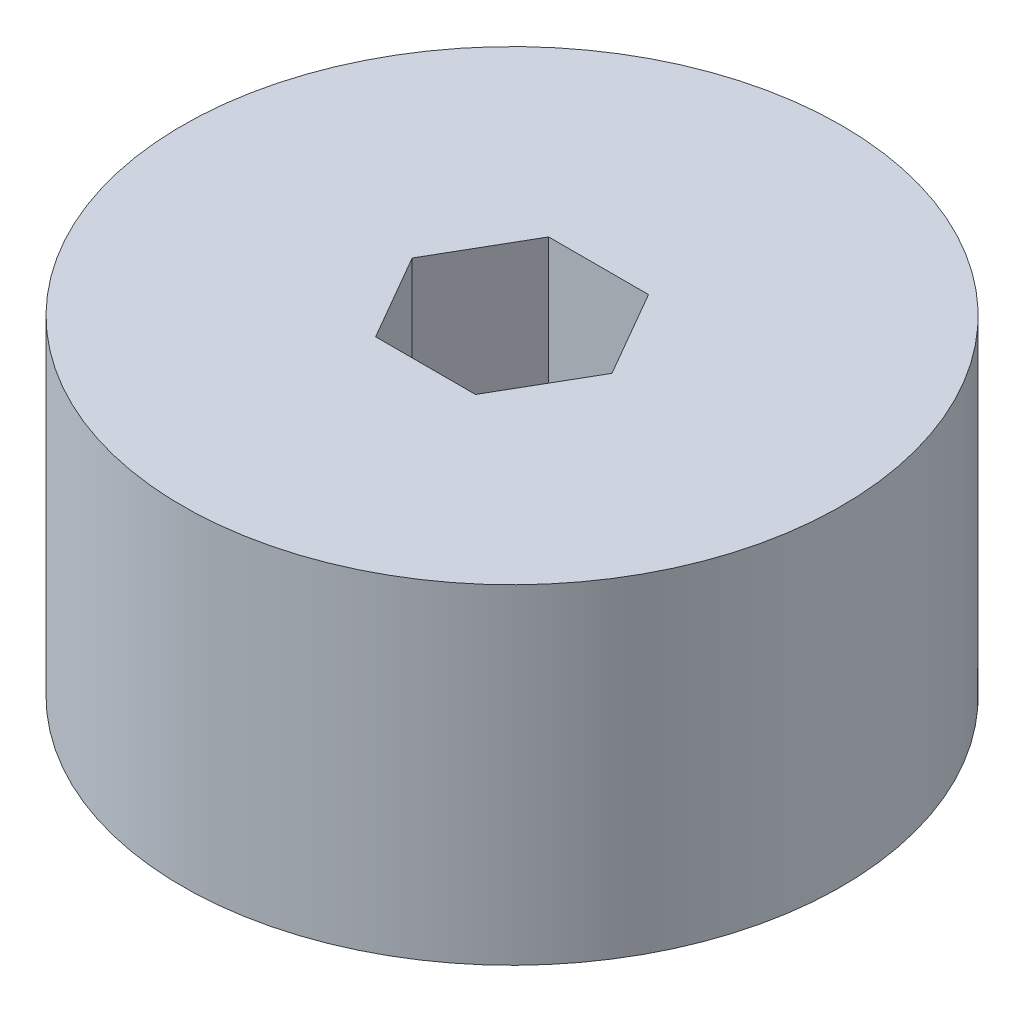
ISO-10303-21;
HEADER;
FILE_DESCRIPTION(('STEP AP214'),'2;1');
FILE_NAME('part.step','',(''),(''),'','','');
FILE_SCHEMA(('AUTOMOTIVE_DESIGN { 1 0 10303 214 1 1 1 1 }'));
ENDSEC;
DATA;
#1=APPLICATION_CONTEXT('core data for automotive mechanical design processes');
#2=APPLICATION_PROTOCOL_DEFINITION('international standard','automotive_design',2000,#1);
#3=PRODUCT_CONTEXT('',#1,'mechanical');
#4=PRODUCT('Part','Part','',(#3));
#5=PRODUCT_RELATED_PRODUCT_CATEGORY('part','',(#4));
#6=PRODUCT_DEFINITION_FORMATION('','',#4);
#7=PRODUCT_DEFINITION_CONTEXT('part definition',#1,'design');
#8=PRODUCT_DEFINITION('design','',#6,#7);
#9=PRODUCT_DEFINITION_SHAPE('','',#8);
#10=(LENGTH_UNIT() NAMED_UNIT(*) SI_UNIT(.MILLI.,.METRE.));
#11=(NAMED_UNIT(*) PLANE_ANGLE_UNIT() SI_UNIT($,.RADIAN.));
#12=(NAMED_UNIT(*) SI_UNIT($,.STERADIAN.) SOLID_ANGLE_UNIT());
#13=UNCERTAINTY_MEASURE_WITH_UNIT(LENGTH_MEASURE(1.E-05),#10,'distance_accuracy_value','');
#14=(GEOMETRIC_REPRESENTATION_CONTEXT(3) GLOBAL_UNCERTAINTY_ASSIGNED_CONTEXT((#13)) GLOBAL_UNIT_ASSIGNED_CONTEXT((#10,
#11,#12)) REPRESENTATION_CONTEXT('',''));
#15=CARTESIAN_POINT('',(0.,0.,0.));
#16=DIRECTION('',(0.,0.,1.));
#17=DIRECTION('',(1.,0.,0.));
#18=AXIS2_PLACEMENT_3D('',#15,#16,#17);
#19=CARTESIAN_POINT('',(0.,4.7625,0.));
#20=DIRECTION('',(0.,-1.,0.));
#21=DIRECTION('',(0.,0.,-1.));
#22=AXIS2_PLACEMENT_3D('',#19,#20,#21);
#23=CYLINDRICAL_SURFACE('',#22,4.7625);
#24=CARTESIAN_POINT('',(0.,4.7625,0.));
#25=DIRECTION('',(0.,1.,0.));
#26=DIRECTION('',(0.,0.,1.));
#27=AXIS2_PLACEMENT_3D('',#24,#25,#26);
#28=CIRCLE('',#27,4.7625);
#29=CARTESIAN_POINT('',(0.,4.7625,-4.7625));
#30=VERTEX_POINT('',#29);
#31=EDGE_CURVE('E11',#30,#30,#28,.T.);
#32=CARTESIAN_POINT('',(0.,0.,0.));
#33=DIRECTION('',(0.,1.,0.));
#34=DIRECTION('',(0.,0.,1.));
#35=AXIS2_PLACEMENT_3D('',#32,#33,#34);
#36=CIRCLE('',#35,4.7625);
#37=CARTESIAN_POINT('',(0.,0.,-4.7625));
#38=VERTEX_POINT('',#37);
#39=EDGE_CURVE('E38',#38,#38,#36,.T.);
#40=CARTESIAN_POINT('',(0.,4.7625,-4.7625));
#41=CARTESIAN_POINT('',(0.,4.712890625,-4.7625));
#42=CARTESIAN_POINT('',(0.,4.66328125,-4.7625));
#43=CARTESIAN_POINT('',(0.,4.5640625,-4.7625));
#44=CARTESIAN_POINT('',(0.,4.514453125,-4.7625));
#45=CARTESIAN_POINT('',(0.,4.415234375,-4.7625));
#46=CARTESIAN_POINT('',(0.,4.365625,-4.7625));
#47=CARTESIAN_POINT('',(0.,4.26640625,-4.7625));
#48=CARTESIAN_POINT('',(0.,4.216796875,-4.7625));
#49=CARTESIAN_POINT('',(0.,4.117578125,-4.7625));
#50=CARTESIAN_POINT('',(0.,4.06796875,-4.7625));
#51=CARTESIAN_POINT('',(0.,3.96875,-4.7625));
#52=CARTESIAN_POINT('',(0.,3.919140625,-4.7625));
#53=CARTESIAN_POINT('',(0.,3.819921875,-4.7625));
#54=CARTESIAN_POINT('',(0.,3.7703125,-4.7625));
#55=CARTESIAN_POINT('',(0.,3.67109375,-4.7625));
#56=CARTESIAN_POINT('',(0.,3.621484375,-4.7625));
#57=CARTESIAN_POINT('',(0.,3.522265625,-4.7625));
#58=CARTESIAN_POINT('',(0.,3.47265625,-4.7625));
#59=CARTESIAN_POINT('',(0.,3.3734375,-4.7625));
#60=CARTESIAN_POINT('',(0.,3.323828125,-4.7625));
#61=CARTESIAN_POINT('',(0.,3.224609375,-4.7625));
#62=CARTESIAN_POINT('',(0.,3.175,-4.7625));
#63=CARTESIAN_POINT('',(0.,3.07578125,-4.7625));
#64=CARTESIAN_POINT('',(0.,3.026171875,-4.7625));
#65=CARTESIAN_POINT('',(0.,2.926953125,-4.7625));
#66=CARTESIAN_POINT('',(0.,2.87734375,-4.7625));
#67=CARTESIAN_POINT('',(0.,2.778125,-4.7625));
#68=CARTESIAN_POINT('',(0.,2.728515625,-4.7625));
#69=CARTESIAN_POINT('',(0.,2.629296875,-4.7625));
#70=CARTESIAN_POINT('',(0.,2.5796875,-4.7625));
#71=CARTESIAN_POINT('',(0.,2.48046875,-4.7625));
#72=CARTESIAN_POINT('',(0.,2.430859375,-4.7625));
#73=CARTESIAN_POINT('',(0.,2.331640625,-4.7625));
#74=CARTESIAN_POINT('',(0.,2.28203125,-4.7625));
#75=CARTESIAN_POINT('',(0.,2.1828125,-4.7625));
#76=CARTESIAN_POINT('',(0.,2.133203125,-4.7625));
#77=CARTESIAN_POINT('',(0.,2.033984375,-4.7625));
#78=CARTESIAN_POINT('',(0.,1.984375,-4.7625));
#79=CARTESIAN_POINT('',(0.,1.88515625,-4.7625));
#80=CARTESIAN_POINT('',(0.,1.835546875,-4.7625));
#81=CARTESIAN_POINT('',(0.,1.736328125,-4.7625));
#82=CARTESIAN_POINT('',(0.,1.68671875,-4.7625));
#83=CARTESIAN_POINT('',(0.,1.5875,-4.7625));
#84=CARTESIAN_POINT('',(0.,1.537890625,-4.7625));
#85=CARTESIAN_POINT('',(0.,1.438671875,-4.7625));
#86=CARTESIAN_POINT('',(0.,1.3890625,-4.7625));
#87=CARTESIAN_POINT('',(0.,1.28984375,-4.7625));
#88=CARTESIAN_POINT('',(0.,1.240234375,-4.7625));
#89=CARTESIAN_POINT('',(0.,1.141015625,-4.7625));
#90=CARTESIAN_POINT('',(0.,1.09140625,-4.7625));
#91=CARTESIAN_POINT('',(0.,0.992187499999999,-4.7625));
#92=CARTESIAN_POINT('',(0.,0.942578124999999,-4.7625));
#93=CARTESIAN_POINT('',(0.,0.843359375,-4.7625));
#94=CARTESIAN_POINT('',(0.,0.79375,-4.7625));
#95=CARTESIAN_POINT('',(0.,0.69453125,-4.7625));
#96=CARTESIAN_POINT('',(0.,0.644921875,-4.7625));
#97=CARTESIAN_POINT('',(0.,0.545703125,-4.7625));
#98=CARTESIAN_POINT('',(0.,0.49609375,-4.7625));
#99=CARTESIAN_POINT('',(0.,0.396875,-4.7625));
#100=CARTESIAN_POINT('',(0.,0.347265625,-4.7625));
#101=CARTESIAN_POINT('',(0.,0.248046875,-4.7625));
#102=CARTESIAN_POINT('',(0.,0.1984375,-4.7625));
#103=CARTESIAN_POINT('',(0.,0.09921875,-4.7625));
#104=CARTESIAN_POINT('',(0.,0.049609375,-4.7625));
#105=CARTESIAN_POINT('',(0.,0.,-4.7625));
#106=B_SPLINE_CURVE_WITH_KNOTS('',3,(#40,#41,#42,#43,#44,#45,#46,#47,#48,#49,#50,#51,#52,#53,
#54,#55,#56,#57,#58,#59,#60,#61,#62,#63,#64,#65,#66,#67,#68,#69,#70,#71,#72,#73,#74,#75,#76,#77,
#78,#79,#80,#81,#82,#83,#84,#85,#86,#87,#88,#89,#90,#91,#92,#93,#94,#95,#96,#97,#98,#99,#100,
#101,#102,#103,#104,#105),.UNSPECIFIED.,.F.,.F.,(4,2,2,2,2,2,2,2,2,2,2,2,2,2,2,2,2,2,2,2,2,2,2,
2,2,2,2,2,2,2,2,2,4),(0.,0.148828125,0.29765625,0.446484375,0.5953125,0.744140625,
0.892968750000001,1.041796875,1.190625,1.339453125,1.48828125,1.637109375,1.7859375,1.934765625,
2.08359375,2.232421875,2.38125,2.530078125,2.67890625,2.827734375,2.9765625,3.125390625,
3.27421875,3.423046875,3.571875,3.720703125,3.86953125,4.018359375,4.1671875,4.316015625,
4.46484375,4.613671875,4.7625),.UNSPECIFIED.);
#107=EDGE_CURVE('BSEAM35',#30,#38,#106,.T.);
#108=ORIENTED_EDGE('',*,*,#31,.F.);
#109=ORIENTED_EDGE('',*,*,#39,.T.);
#110=ORIENTED_EDGE('',*,*,#107,.T.);
#111=ORIENTED_EDGE('',*,*,#107,.F.);
#112=EDGE_LOOP('',(#108,#110,#109,#111));
#113=FACE_BOUND('',#112,.T.);
#114=ADVANCED_FACE('F35',(#113),#23,.T.);
#115=CARTESIAN_POINT('',(0.,4.7625,0.));
#116=DIRECTION('',(0.,1.,0.));
#117=DIRECTION('',(0.,0.,1.));
#118=AXIS2_PLACEMENT_3D('',#115,#116,#117);
#119=PLANE('',#118);
#120=DIRECTION('',(-0.5,0.,0.866025403784438));
#121=VECTOR('',#120,1.);
#122=CARTESIAN_POINT('',(1.44337567297406,4.7625,0.));
#123=LINE('',#122,#121);
#124=CARTESIAN_POINT('',(1.44337567297406,4.7625,0.));
#125=VERTEX_POINT('',#124);
#126=CARTESIAN_POINT('',(0.721687836487032,4.7625,1.25));
#127=VERTEX_POINT('',#126);
#128=EDGE_CURVE('E89',#125,#127,#123,.T.);
#129=ORIENTED_EDGE('',*,*,#128,.T.);
#130=DIRECTION('',(-1.,0.,0.));
#131=VECTOR('',#130,1.);
#132=CARTESIAN_POINT('',(0.721687836487032,4.7625,1.25));
#133=LINE('',#132,#131);
#134=CARTESIAN_POINT('',(-0.721687836487032,4.7625,1.25));
#135=VERTEX_POINT('',#134);
#136=EDGE_CURVE('E98',#127,#135,#133,.T.);
#137=ORIENTED_EDGE('',*,*,#136,.T.);
#138=DIRECTION('',(-0.5,0.,-0.866025403784439));
#139=VECTOR('',#138,1.);
#140=CARTESIAN_POINT('',(-0.721687836487032,4.7625,1.25));
#141=LINE('',#140,#139);
#142=CARTESIAN_POINT('',(-1.44337567297406,4.7625,0.));
#143=VERTEX_POINT('',#142);
#144=EDGE_CURVE('E49',#135,#143,#141,.T.);
#145=ORIENTED_EDGE('',*,*,#144,.T.);
#146=DIRECTION('',(0.5,0.,-0.866025403784439));
#147=VECTOR('',#146,1.);
#148=CARTESIAN_POINT('',(-1.44337567297406,4.7625,0.));
#149=LINE('',#148,#147);
#150=CARTESIAN_POINT('',(-0.721687836487032,4.7625,-1.25));
#151=VERTEX_POINT('',#150);
#152=EDGE_CURVE('E113',#143,#151,#149,.T.);
#153=ORIENTED_EDGE('',*,*,#152,.T.);
#154=DIRECTION('',(1.,0.,0.));
#155=VECTOR('',#154,1.);
#156=CARTESIAN_POINT('',(-0.721687836487032,4.7625,-1.25));
#157=LINE('',#156,#155);
#158=CARTESIAN_POINT('',(0.721687836487032,4.7625,-1.25));
#159=VERTEX_POINT('',#158);
#160=EDGE_CURVE('E116',#151,#159,#157,.T.);
#161=ORIENTED_EDGE('',*,*,#160,.T.);
#162=DIRECTION('',(0.5,0.,0.866025403784438));
#163=VECTOR('',#162,1.);
#164=CARTESIAN_POINT('',(0.721687836487032,4.7625,-1.25));
#165=LINE('',#164,#163);
#166=EDGE_CURVE('E95',#159,#125,#165,.T.);
#167=ORIENTED_EDGE('',*,*,#166,.T.);
#168=EDGE_LOOP('',(#129,#137,#145,#153,#161,#167));
#169=FACE_BOUND('',#168,.T.);
#170=ORIENTED_EDGE('',*,*,#31,.T.);
#171=EDGE_LOOP('',(#170));
#172=FACE_BOUND('',#171,.T.);
#173=ADVANCED_FACE('F102',(#169,#172),#119,.T.);
#174=CARTESIAN_POINT('',(0.,0.,0.));
#175=DIRECTION('',(0.,1.,0.));
#176=DIRECTION('',(0.,0.,1.));
#177=AXIS2_PLACEMENT_3D('',#174,#175,#176);
#178=PLANE('',#177);
#179=DIRECTION('',(-1.,0.,0.));
#180=VECTOR('',#179,1.);
#181=CARTESIAN_POINT('',(0.721687836487032,0.,1.25));
#182=LINE('',#181,#180);
#183=CARTESIAN_POINT('',(0.721687836487032,0.,1.25));
#184=VERTEX_POINT('',#183);
#185=CARTESIAN_POINT('',(-0.721687836487032,0.,1.25));
#186=VERTEX_POINT('',#185);
#187=EDGE_CURVE('E120',#184,#186,#182,.T.);
#188=ORIENTED_EDGE('',*,*,#187,.F.);
#189=DIRECTION('',(-0.5,0.,0.866025403784438));
#190=VECTOR('',#189,1.);
#191=CARTESIAN_POINT('',(1.44337567297406,0.,0.));
#192=LINE('',#191,#190);
#193=CARTESIAN_POINT('',(1.44337567297406,0.,0.));
#194=VERTEX_POINT('',#193);
#195=EDGE_CURVE('E57',#194,#184,#192,.T.);
#196=ORIENTED_EDGE('',*,*,#195,.F.);
#197=DIRECTION('',(0.5,0.,0.866025403784438));
#198=VECTOR('',#197,1.);
#199=CARTESIAN_POINT('',(0.721687836487032,0.,-1.25));
#200=LINE('',#199,#198);
#201=CARTESIAN_POINT('',(0.721687836487032,0.,-1.25));
#202=VERTEX_POINT('',#201);
#203=EDGE_CURVE('E106',#202,#194,#200,.T.);
#204=ORIENTED_EDGE('',*,*,#203,.F.);
#205=DIRECTION('',(1.,0.,0.));
#206=VECTOR('',#205,1.);
#207=CARTESIAN_POINT('',(-0.721687836487032,0.,-1.25));
#208=LINE('',#207,#206);
#209=CARTESIAN_POINT('',(-0.721687836487032,0.,-1.25));
#210=VERTEX_POINT('',#209);
#211=EDGE_CURVE('E109',#210,#202,#208,.T.);
#212=ORIENTED_EDGE('',*,*,#211,.F.);
#213=DIRECTION('',(0.5,0.,-0.866025403784439));
#214=VECTOR('',#213,1.);
#215=CARTESIAN_POINT('',(-1.44337567297406,0.,0.));
#216=LINE('',#215,#214);
#217=CARTESIAN_POINT('',(-1.44337567297406,0.,0.));
#218=VERTEX_POINT('',#217);
#219=EDGE_CURVE('E125',#218,#210,#216,.T.);
#220=ORIENTED_EDGE('',*,*,#219,.F.);
#221=DIRECTION('',(-0.5,0.,-0.866025403784439));
#222=VECTOR('',#221,1.);
#223=CARTESIAN_POINT('',(-0.721687836487032,0.,1.25));
#224=LINE('',#223,#222);
#225=EDGE_CURVE('E122',#186,#218,#224,.T.);
#226=ORIENTED_EDGE('',*,*,#225,.F.);
#227=EDGE_LOOP('',(#188,#196,#204,#212,#220,#226));
#228=FACE_BOUND('',#227,.T.);
#229=ORIENTED_EDGE('',*,*,#39,.F.);
#230=EDGE_LOOP('',(#229));
#231=FACE_BOUND('',#230,.T.);
#232=ADVANCED_FACE('F142',(#228,#231),#178,.F.);
#233=CARTESIAN_POINT('',(1.44337567297406,4.7625,0.));
#234=DIRECTION('',(0.866025403784438,0.,0.5));
#235=DIRECTION('',(0.5,0.,-0.866025403784438));
#236=AXIS2_PLACEMENT_3D('',#233,#234,#235);
#237=PLANE('',#236);
#238=ORIENTED_EDGE('',*,*,#195,.T.);
#239=DIRECTION('',(0.,-1.,0.));
#240=VECTOR('',#239,1.);
#241=CARTESIAN_POINT('',(0.721687836487032,4.7625,1.25));
#242=LINE('',#241,#240);
#243=EDGE_CURVE('E85',#127,#184,#242,.T.);
#244=ORIENTED_EDGE('',*,*,#243,.F.);
#245=ORIENTED_EDGE('',*,*,#128,.F.);
#246=DIRECTION('',(0.,-1.,0.));
#247=VECTOR('',#246,1.);
#248=CARTESIAN_POINT('',(1.44337567297406,4.7625,0.));
#249=LINE('',#248,#247);
#250=EDGE_CURVE('E130',#125,#194,#249,.T.);
#251=ORIENTED_EDGE('',*,*,#250,.T.);
#252=EDGE_LOOP('',(#238,#244,#245,#251));
#253=FACE_BOUND('',#252,.T.);
#254=ADVANCED_FACE('F87',(#253),#237,.F.);
#255=CARTESIAN_POINT('',(0.721687836487032,4.7625,-1.25));
#256=DIRECTION('',(0.866025403784438,0.,-0.5));
#257=DIRECTION('',(-0.5,0.,-0.866025403784438));
#258=AXIS2_PLACEMENT_3D('',#255,#256,#257);
#259=PLANE('',#258);
#260=ORIENTED_EDGE('',*,*,#203,.T.);
#261=ORIENTED_EDGE('',*,*,#250,.F.);
#262=ORIENTED_EDGE('',*,*,#166,.F.);
#263=DIRECTION('',(0.,-1.,0.));
#264=VECTOR('',#263,1.);
#265=CARTESIAN_POINT('',(0.721687836487032,4.7625,-1.25));
#266=LINE('',#265,#264);
#267=EDGE_CURVE('E132',#159,#202,#266,.T.);
#268=ORIENTED_EDGE('',*,*,#267,.T.);
#269=EDGE_LOOP('',(#260,#261,#262,#268));
#270=FACE_BOUND('',#269,.T.);
#271=ADVANCED_FACE('F153',(#270),#259,.F.);
#272=CARTESIAN_POINT('',(-0.721687836487032,4.7625,-1.25));
#273=DIRECTION('',(0.,0.,-1.));
#274=DIRECTION('',(-1.,0.,0.));
#275=AXIS2_PLACEMENT_3D('',#272,#273,#274);
#276=PLANE('',#275);
#277=ORIENTED_EDGE('',*,*,#211,.T.);
#278=ORIENTED_EDGE('',*,*,#267,.F.);
#279=ORIENTED_EDGE('',*,*,#160,.F.);
#280=DIRECTION('',(0.,-1.,0.));
#281=VECTOR('',#280,1.);
#282=CARTESIAN_POINT('',(-0.721687836487032,4.7625,-1.25));
#283=LINE('',#282,#281);
#284=EDGE_CURVE('E134',#151,#210,#283,.T.);
#285=ORIENTED_EDGE('',*,*,#284,.T.);
#286=EDGE_LOOP('',(#277,#278,#279,#285));
#287=FACE_BOUND('',#286,.T.);
#288=ADVANCED_FACE('F151',(#287),#276,.F.);
#289=CARTESIAN_POINT('',(-1.44337567297406,4.7625,0.));
#290=DIRECTION('',(-0.866025403784439,0.,-0.5));
#291=DIRECTION('',(-0.5,0.,0.866025403784439));
#292=AXIS2_PLACEMENT_3D('',#289,#290,#291);
#293=PLANE('',#292);
#294=ORIENTED_EDGE('',*,*,#219,.T.);
#295=ORIENTED_EDGE('',*,*,#284,.F.);
#296=ORIENTED_EDGE('',*,*,#152,.F.);
#297=DIRECTION('',(0.,-1.,0.));
#298=VECTOR('',#297,1.);
#299=CARTESIAN_POINT('',(-1.44337567297406,4.7625,0.));
#300=LINE('',#299,#298);
#301=EDGE_CURVE('E136',#143,#218,#300,.T.);
#302=ORIENTED_EDGE('',*,*,#301,.T.);
#303=EDGE_LOOP('',(#294,#295,#296,#302));
#304=FACE_BOUND('',#303,.T.);
#305=ADVANCED_FACE('F147',(#304),#293,.F.);
#306=CARTESIAN_POINT('',(-0.721687836487032,4.7625,1.25));
#307=DIRECTION('',(-0.866025403784439,0.,0.5));
#308=DIRECTION('',(0.5,0.,0.866025403784439));
#309=AXIS2_PLACEMENT_3D('',#306,#307,#308);
#310=PLANE('',#309);
#311=ORIENTED_EDGE('',*,*,#225,.T.);
#312=ORIENTED_EDGE('',*,*,#301,.F.);
#313=ORIENTED_EDGE('',*,*,#144,.F.);
#314=DIRECTION('',(0.,-1.,0.));
#315=VECTOR('',#314,1.);
#316=CARTESIAN_POINT('',(-0.721687836487032,4.7625,1.25));
#317=LINE('',#316,#315);
#318=EDGE_CURVE('E94',#135,#186,#317,.T.);
#319=ORIENTED_EDGE('',*,*,#318,.T.);
#320=EDGE_LOOP('',(#311,#312,#313,#319));
#321=FACE_BOUND('',#320,.T.);
#322=ADVANCED_FACE('F138',(#321),#310,.F.);
#323=CARTESIAN_POINT('',(0.721687836487032,4.7625,1.25));
#324=DIRECTION('',(0.,0.,1.));
#325=DIRECTION('',(1.,0.,0.));
#326=AXIS2_PLACEMENT_3D('',#323,#324,#325);
#327=PLANE('',#326);
#328=ORIENTED_EDGE('',*,*,#187,.T.);
#329=ORIENTED_EDGE('',*,*,#318,.F.);
#330=ORIENTED_EDGE('',*,*,#136,.F.);
#331=ORIENTED_EDGE('',*,*,#243,.T.);
#332=EDGE_LOOP('',(#328,#329,#330,#331));
#333=FACE_BOUND('',#332,.T.);
#334=ADVANCED_FACE('F99',(#333),#327,.F.);
#335=CLOSED_SHELL('',(#114,#173,#232,#254,#271,#288,#305,#322,#334));
#336=MANIFOLD_SOLID_BREP('B2',#335);
#337=ADVANCED_BREP_SHAPE_REPRESENTATION('',(#18,#336),#14);
#338=SHAPE_DEFINITION_REPRESENTATION(#9,#337);
ENDSEC;
END-ISO-10303-21;
